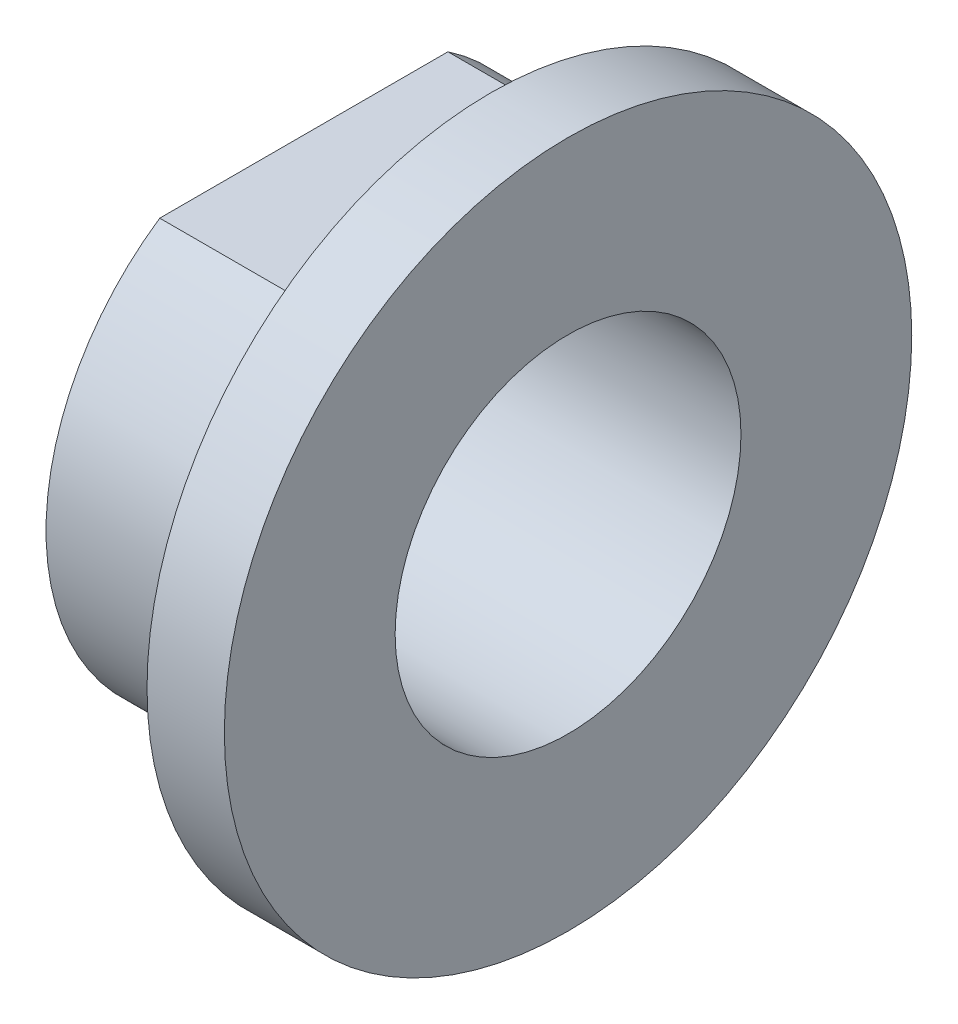
ISO-10303-21;
HEADER;
FILE_DESCRIPTION(('STEP AP214'),'2;1');
FILE_NAME('part.step','',(''),(''),'','','');
FILE_SCHEMA(('AUTOMOTIVE_DESIGN { 1 0 10303 214 1 1 1 1 }'));
ENDSEC;
DATA;
#1=APPLICATION_CONTEXT('core data for automotive mechanical design processes');
#2=APPLICATION_PROTOCOL_DEFINITION('international standard','automotive_design',2000,#1);
#3=PRODUCT_CONTEXT('',#1,'mechanical');
#4=PRODUCT('Part','Part','',(#3));
#5=PRODUCT_RELATED_PRODUCT_CATEGORY('part','',(#4));
#6=PRODUCT_DEFINITION_FORMATION('','',#4);
#7=PRODUCT_DEFINITION_CONTEXT('part definition',#1,'design');
#8=PRODUCT_DEFINITION('design','',#6,#7);
#9=PRODUCT_DEFINITION_SHAPE('','',#8);
#10=(LENGTH_UNIT() NAMED_UNIT(*) SI_UNIT(.MILLI.,.METRE.));
#11=(NAMED_UNIT(*) PLANE_ANGLE_UNIT() SI_UNIT($,.RADIAN.));
#12=(NAMED_UNIT(*) SI_UNIT($,.STERADIAN.) SOLID_ANGLE_UNIT());
#13=UNCERTAINTY_MEASURE_WITH_UNIT(LENGTH_MEASURE(1.E-05),#10,'distance_accuracy_value','');
#14=(GEOMETRIC_REPRESENTATION_CONTEXT(3) GLOBAL_UNCERTAINTY_ASSIGNED_CONTEXT((#13)) GLOBAL_UNIT_ASSIGNED_CONTEXT((#10,
#11,#12)) REPRESENTATION_CONTEXT('',''));
#15=CARTESIAN_POINT('',(0.,0.,0.));
#16=DIRECTION('',(0.,0.,1.));
#17=DIRECTION('',(1.,0.,0.));
#18=AXIS2_PLACEMENT_3D('',#15,#16,#17);
#19=CARTESIAN_POINT('',(0.,0.,0.));
#20=DIRECTION('',(1.,0.,0.));
#21=DIRECTION('',(0.,0.,-1.));
#22=AXIS2_PLACEMENT_3D('',#19,#20,#21);
#23=CYLINDRICAL_SURFACE('',#22,6.);
#24=DIRECTION('',(-1.,0.,0.));
#25=VECTOR('',#24,1.);
#26=CARTESIAN_POINT('',(4.98587687775133,4.975,-3.35400879545657));
#27=LINE('',#26,#25);
#28=CARTESIAN_POINT('',(-1.8,4.975,-3.35400879545657));
#29=VERTEX_POINT('',#28);
#30=CARTESIAN_POINT('',(-6.15,4.975,-3.35400879545657));
#31=VERTEX_POINT('',#30);
#32=EDGE_CURVE('E85',#29,#31,#27,.T.);
#33=ORIENTED_EDGE('',*,*,#32,.F.);
#34=CARTESIAN_POINT('',(-1.8,0.,0.));
#35=DIRECTION('',(1.,0.,0.));
#36=DIRECTION('',(0.,0.,-1.));
#37=AXIS2_PLACEMENT_3D('',#34,#35,#36);
#38=CIRCLE('',#37,6.);
#39=CARTESIAN_POINT('',(-1.8,-4.975,-3.35400879545657));
#40=VERTEX_POINT('',#39);
#41=EDGE_CURVE('E113',#40,#29,#38,.T.);
#42=ORIENTED_EDGE('',*,*,#41,.F.);
#43=DIRECTION('',(-1.,0.,0.));
#44=VECTOR('',#43,1.);
#45=CARTESIAN_POINT('',(4.98587687775133,-4.975,-3.35400879545657));
#46=LINE('',#45,#44);
#47=CARTESIAN_POINT('',(-6.15,-4.975,-3.35400879545657));
#48=VERTEX_POINT('',#47);
#49=EDGE_CURVE('E108',#40,#48,#46,.T.);
#50=ORIENTED_EDGE('',*,*,#49,.T.);
#51=CARTESIAN_POINT('',(-6.15,0.,0.));
#52=DIRECTION('',(1.,0.,0.));
#53=DIRECTION('',(0.,0.,-1.));
#54=AXIS2_PLACEMENT_3D('',#51,#52,#53);
#55=CIRCLE('',#54,6.);
#56=EDGE_CURVE('E101',#48,#31,#55,.T.);
#57=ORIENTED_EDGE('',*,*,#56,.T.);
#58=EDGE_LOOP('',(#33,#42,#50,#57));
#59=FACE_BOUND('',#58,.T.);
#60=ADVANCED_FACE('F45',(#59),#23,.T.);
#61=CARTESIAN_POINT('',(-6.15,6.,0.));
#62=DIRECTION('',(-1.,0.,0.));
#63=DIRECTION('',(0.,0.,1.));
#64=AXIS2_PLACEMENT_3D('',#61,#62,#63);
#65=PLANE('',#64);
#66=DIRECTION('',(0.,0.,1.));
#67=VECTOR('',#66,1.);
#68=CARTESIAN_POINT('',(-6.15,4.975,3.35400879545657));
#69=LINE('',#68,#67);
#70=CARTESIAN_POINT('',(-6.15,4.975,3.35400879545657));
#71=VERTEX_POINT('',#70);
#72=EDGE_CURVE('E88',#31,#71,#69,.T.);
#73=ORIENTED_EDGE('',*,*,#72,.F.);
#74=ORIENTED_EDGE('',*,*,#56,.F.);
#75=DIRECTION('',(0.,0.,-1.));
#76=VECTOR('',#75,1.);
#77=CARTESIAN_POINT('',(-6.15,-4.975,3.35400879545657));
#78=LINE('',#77,#76);
#79=CARTESIAN_POINT('',(-6.15,-4.975,3.35400879545657));
#80=VERTEX_POINT('',#79);
#81=EDGE_CURVE('E105',#80,#48,#78,.T.);
#82=ORIENTED_EDGE('',*,*,#81,.F.);
#83=EDGE_CURVE('E103',#71,#80,#55,.T.);
#84=ORIENTED_EDGE('',*,*,#83,.F.);
#85=EDGE_LOOP('',(#73,#74,#82,#84));
#86=FACE_BOUND('',#85,.T.);
#87=CARTESIAN_POINT('',(-6.15,0.,0.));
#88=DIRECTION('',(1.,0.,0.));
#89=DIRECTION('',(0.,0.,-1.));
#90=AXIS2_PLACEMENT_3D('',#87,#88,#89);
#91=CIRCLE('',#90,4.025);
#92=CARTESIAN_POINT('',(-6.15,0.,-4.025));
#93=VERTEX_POINT('',#92);
#94=EDGE_CURVE('E11',#93,#93,#91,.T.);
#95=ORIENTED_EDGE('',*,*,#94,.T.);
#96=EDGE_LOOP('',(#95));
#97=FACE_BOUND('',#96,.T.);
#98=ADVANCED_FACE('F47',(#86,#97),#65,.T.);
#99=CARTESIAN_POINT('',(0.,0.,0.));
#100=DIRECTION('',(1.,0.,0.));
#101=DIRECTION('',(0.,0.,-1.));
#102=AXIS2_PLACEMENT_3D('',#99,#100,#101);
#103=CYLINDRICAL_SURFACE('',#102,4.025);
#104=CARTESIAN_POINT('',(0.,0.,0.));
#105=DIRECTION('',(1.,0.,0.));
#106=DIRECTION('',(0.,0.,-1.));
#107=AXIS2_PLACEMENT_3D('',#104,#105,#106);
#108=CIRCLE('',#107,4.025);
#109=CARTESIAN_POINT('',(0.,0.,-4.025));
#110=VERTEX_POINT('',#109);
#111=EDGE_CURVE('E54',#110,#110,#108,.T.);
#112=ORIENTED_EDGE('',*,*,#111,.T.);
#113=EDGE_LOOP('',(#112));
#114=FACE_BOUND('',#113,.T.);
#115=ORIENTED_EDGE('',*,*,#94,.F.);
#116=EDGE_LOOP('',(#115));
#117=FACE_BOUND('',#116,.T.);
#118=ADVANCED_FACE('F132',(#114,#117),#103,.F.);
#119=CARTESIAN_POINT('',(0.,4.025,0.));
#120=DIRECTION('',(1.,0.,0.));
#121=DIRECTION('',(0.,0.,-1.));
#122=AXIS2_PLACEMENT_3D('',#119,#120,#121);
#123=PLANE('',#122);
#124=CARTESIAN_POINT('',(0.,0.,0.));
#125=DIRECTION('',(1.,0.,0.));
#126=DIRECTION('',(0.,0.,-1.));
#127=AXIS2_PLACEMENT_3D('',#124,#125,#126);
#128=CIRCLE('',#127,8.);
#129=CARTESIAN_POINT('',(0.,0.,-8.));
#130=VERTEX_POINT('',#129);
#131=EDGE_CURVE('E125',#130,#130,#128,.T.);
#132=ORIENTED_EDGE('',*,*,#131,.T.);
#133=EDGE_LOOP('',(#132));
#134=FACE_BOUND('',#133,.T.);
#135=ORIENTED_EDGE('',*,*,#111,.F.);
#136=EDGE_LOOP('',(#135));
#137=FACE_BOUND('',#136,.T.);
#138=ADVANCED_FACE('F135',(#134,#137),#123,.T.);
#139=CARTESIAN_POINT('',(0.,0.,0.));
#140=DIRECTION('',(1.,0.,0.));
#141=DIRECTION('',(0.,0.,-1.));
#142=AXIS2_PLACEMENT_3D('',#139,#140,#141);
#143=CYLINDRICAL_SURFACE('',#142,8.);
#144=CARTESIAN_POINT('',(-1.8,0.,0.));
#145=DIRECTION('',(1.,0.,0.));
#146=DIRECTION('',(0.,0.,-1.));
#147=AXIS2_PLACEMENT_3D('',#144,#145,#146);
#148=CIRCLE('',#147,8.);
#149=CARTESIAN_POINT('',(-1.8,0.,-8.));
#150=VERTEX_POINT('',#149);
#151=EDGE_CURVE('E121',#150,#150,#148,.T.);
#152=ORIENTED_EDGE('',*,*,#151,.T.);
#153=EDGE_LOOP('',(#152));
#154=FACE_BOUND('',#153,.T.);
#155=ORIENTED_EDGE('',*,*,#131,.F.);
#156=EDGE_LOOP('',(#155));
#157=FACE_BOUND('',#156,.T.);
#158=ADVANCED_FACE('F137',(#154,#157),#143,.T.);
#159=CARTESIAN_POINT('',(-1.8,8.,0.));
#160=DIRECTION('',(-1.,0.,0.));
#161=DIRECTION('',(0.,0.,1.));
#162=AXIS2_PLACEMENT_3D('',#159,#160,#161);
#163=PLANE('',#162);
#164=ORIENTED_EDGE('',*,*,#41,.T.);
#165=DIRECTION('',(0.,0.,-1.));
#166=VECTOR('',#165,1.);
#167=CARTESIAN_POINT('',(-1.8,4.975,3.35400879545657));
#168=LINE('',#167,#166);
#169=CARTESIAN_POINT('',(-1.8,4.975,3.35400879545657));
#170=VERTEX_POINT('',#169);
#171=EDGE_CURVE('E66',#170,#29,#168,.T.);
#172=ORIENTED_EDGE('',*,*,#171,.F.);
#173=CARTESIAN_POINT('',(-1.8,-4.975,3.35400879545657));
#174=VERTEX_POINT('',#173);
#175=EDGE_CURVE('E120',#170,#174,#38,.T.);
#176=ORIENTED_EDGE('',*,*,#175,.T.);
#177=DIRECTION('',(0.,0.,1.));
#178=VECTOR('',#177,1.);
#179=CARTESIAN_POINT('',(-1.8,-4.975,3.35400879545657));
#180=LINE('',#179,#178);
#181=EDGE_CURVE('E61',#40,#174,#180,.T.);
#182=ORIENTED_EDGE('',*,*,#181,.F.);
#183=EDGE_LOOP('',(#164,#172,#176,#182));
#184=FACE_BOUND('',#183,.T.);
#185=ORIENTED_EDGE('',*,*,#151,.F.);
#186=EDGE_LOOP('',(#185));
#187=FACE_BOUND('',#186,.T.);
#188=ADVANCED_FACE('F144',(#184,#187),#163,.T.);
#189=DIRECTION('',(-1.,0.,0.));
#190=VECTOR('',#189,1.);
#191=CARTESIAN_POINT('',(4.98587687775133,4.975,3.35400879545657));
#192=LINE('',#191,#190);
#193=EDGE_CURVE('E94',#170,#71,#192,.T.);
#194=ORIENTED_EDGE('',*,*,#193,.T.);
#195=ORIENTED_EDGE('',*,*,#83,.T.);
#196=DIRECTION('',(-1.,0.,0.));
#197=VECTOR('',#196,1.);
#198=CARTESIAN_POINT('',(4.98587687775133,-4.975,3.35400879545657));
#199=LINE('',#198,#197);
#200=EDGE_CURVE('E170',#174,#80,#199,.T.);
#201=ORIENTED_EDGE('',*,*,#200,.F.);
#202=ORIENTED_EDGE('',*,*,#175,.F.);
#203=EDGE_LOOP('',(#194,#195,#201,#202));
#204=FACE_BOUND('',#203,.T.);
#205=ADVANCED_FACE('F149',(#204),#23,.T.);
#206=CARTESIAN_POINT('',(4.98587687775133,-4.975,3.35400879545657));
#207=DIRECTION('',(0.,1.,0.));
#208=DIRECTION('',(0.,0.,1.));
#209=AXIS2_PLACEMENT_3D('',#206,#207,#208);
#210=PLANE('',#209);
#211=ORIENTED_EDGE('',*,*,#181,.T.);
#212=ORIENTED_EDGE('',*,*,#200,.T.);
#213=ORIENTED_EDGE('',*,*,#81,.T.);
#214=ORIENTED_EDGE('',*,*,#49,.F.);
#215=EDGE_LOOP('',(#211,#212,#213,#214));
#216=FACE_BOUND('',#215,.T.);
#217=ADVANCED_FACE('F156',(#216),#210,.F.);
#218=CARTESIAN_POINT('',(4.98587687775133,4.975,3.35400879545657));
#219=DIRECTION('',(0.,-1.,0.));
#220=DIRECTION('',(0.,0.,-1.));
#221=AXIS2_PLACEMENT_3D('',#218,#219,#220);
#222=PLANE('',#221);
#223=ORIENTED_EDGE('',*,*,#171,.T.);
#224=ORIENTED_EDGE('',*,*,#32,.T.);
#225=ORIENTED_EDGE('',*,*,#72,.T.);
#226=ORIENTED_EDGE('',*,*,#193,.F.);
#227=EDGE_LOOP('',(#223,#224,#225,#226));
#228=FACE_BOUND('',#227,.T.);
#229=ADVANCED_FACE('F87',(#228),#222,.F.);
#230=CLOSED_SHELL('',(#60,#98,#118,#138,#158,#188,#205,#217,#229));
#231=MANIFOLD_SOLID_BREP('B2',#230);
#232=ADVANCED_BREP_SHAPE_REPRESENTATION('',(#18,#231),#14);
#233=SHAPE_DEFINITION_REPRESENTATION(#9,#232);
ENDSEC;
END-ISO-10303-21;
